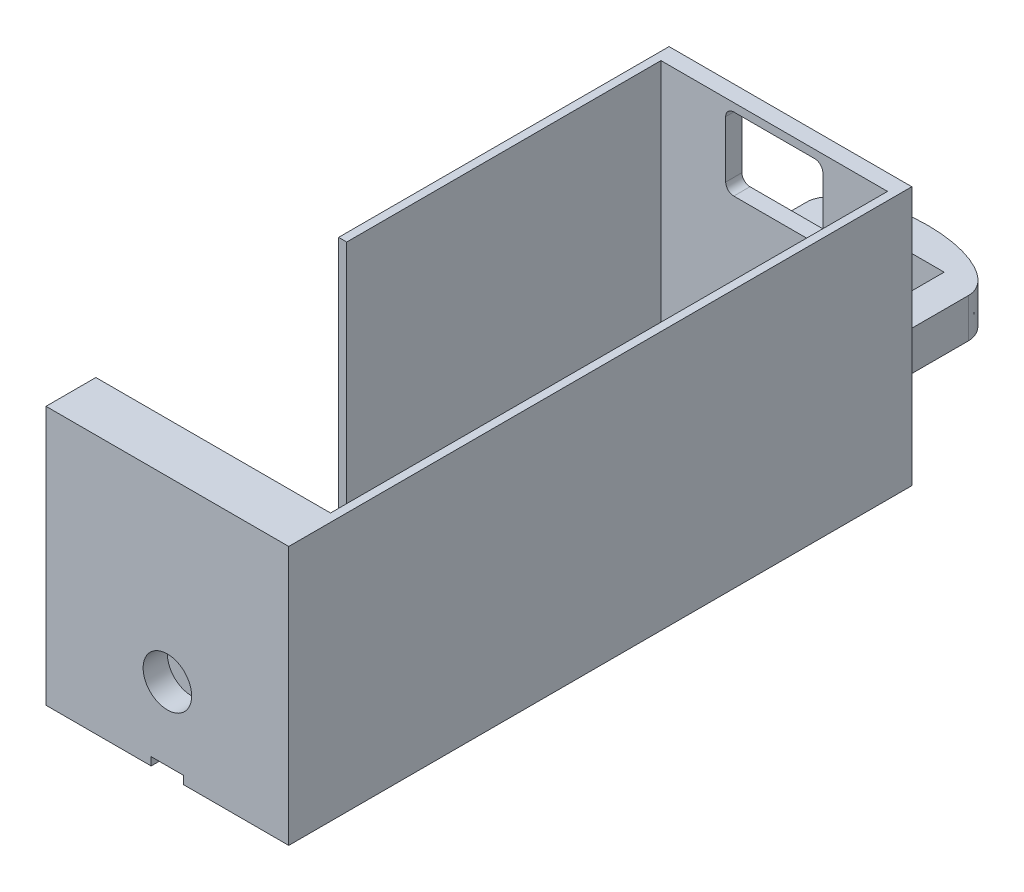
ISO-10303-21;
HEADER;
FILE_DESCRIPTION(('STEP AP214'),'2;1');
FILE_NAME('part.step','',(''),(''),'','','');
FILE_SCHEMA(('AUTOMOTIVE_DESIGN { 1 0 10303 214 1 1 1 1 }'));
ENDSEC;
DATA;
#1=APPLICATION_CONTEXT('core data for automotive mechanical design processes');
#2=APPLICATION_PROTOCOL_DEFINITION('international standard','automotive_design',2000,#1);
#3=PRODUCT_CONTEXT('',#1,'mechanical');
#4=PRODUCT('Part','Part','',(#3));
#5=PRODUCT_RELATED_PRODUCT_CATEGORY('part','',(#4));
#6=PRODUCT_DEFINITION_FORMATION('','',#4);
#7=PRODUCT_DEFINITION_CONTEXT('part definition',#1,'design');
#8=PRODUCT_DEFINITION('design','',#6,#7);
#9=PRODUCT_DEFINITION_SHAPE('','',#8);
#10=(LENGTH_UNIT() NAMED_UNIT(*) SI_UNIT(.MILLI.,.METRE.));
#11=(NAMED_UNIT(*) PLANE_ANGLE_UNIT() SI_UNIT($,.RADIAN.));
#12=(NAMED_UNIT(*) SI_UNIT($,.STERADIAN.) SOLID_ANGLE_UNIT());
#13=UNCERTAINTY_MEASURE_WITH_UNIT(LENGTH_MEASURE(1.E-05),#10,'distance_accuracy_value','');
#14=(GEOMETRIC_REPRESENTATION_CONTEXT(3) GLOBAL_UNCERTAINTY_ASSIGNED_CONTEXT((#13)) GLOBAL_UNIT_ASSIGNED_CONTEXT((#10,
#11,#12)) REPRESENTATION_CONTEXT('',''));
#15=CARTESIAN_POINT('',(0.,0.,0.));
#16=DIRECTION('',(0.,0.,1.));
#17=DIRECTION('',(1.,0.,0.));
#18=AXIS2_PLACEMENT_3D('',#15,#16,#17);
#19=CARTESIAN_POINT('',(0.,0.,0.));
#20=DIRECTION('',(0.,0.,-1.));
#21=DIRECTION('',(-1.,0.,0.));
#22=AXIS2_PLACEMENT_3D('',#19,#20,#21);
#23=PLANE('',#22);
#24=DIRECTION('',(-1.,0.,0.));
#25=VECTOR('',#24,1.);
#26=CARTESIAN_POINT('',(26.,8.,0.));
#27=LINE('',#26,#25);
#28=CARTESIAN_POINT('',(10.,8.,0.));
#29=VERTEX_POINT('',#28);
#30=CARTESIAN_POINT('',(6.,8.,0.));
#31=VERTEX_POINT('',#30);
#32=EDGE_CURVE('E325',#29,#31,#27,.T.);
#33=ORIENTED_EDGE('',*,*,#32,.F.);
#34=DIRECTION('',(0.,1.,0.));
#35=VECTOR('',#34,1.);
#36=CARTESIAN_POINT('',(10.,6.85630345535087,0.));
#37=LINE('',#36,#35);
#38=CARTESIAN_POINT('',(10.,12.8563034553508,0.));
#39=VERTEX_POINT('',#38);
#40=EDGE_CURVE('E308',#29,#39,#37,.T.);
#41=ORIENTED_EDGE('',*,*,#40,.T.);
#42=DIRECTION('',(1.,0.,0.));
#43=VECTOR('',#42,1.);
#44=CARTESIAN_POINT('',(26.,12.8563034553508,0.));
#45=LINE('',#44,#43);
#46=CARTESIAN_POINT('',(6.,12.8563034553508,0.));
#47=VERTEX_POINT('',#46);
#48=EDGE_CURVE('E333',#47,#39,#45,.T.);
#49=ORIENTED_EDGE('',*,*,#48,.F.);
#50=DIRECTION('',(0.,1.,0.));
#51=VECTOR('',#50,1.);
#52=CARTESIAN_POINT('',(6.,8.,0.));
#53=LINE('',#52,#51);
#54=EDGE_CURVE('E329',#31,#47,#53,.T.);
#55=ORIENTED_EDGE('',*,*,#54,.F.);
#56=EDGE_LOOP('',(#33,#41,#49,#55));
#57=FACE_BOUND('',#56,.T.);
#58=DIRECTION('',(0.,1.,0.));
#59=VECTOR('',#58,1.);
#60=CARTESIAN_POINT('',(22.,6.85630345535087,0.));
#61=LINE('',#60,#59);
#62=CARTESIAN_POINT('',(22.,8.,0.));
#63=VERTEX_POINT('',#62);
#64=CARTESIAN_POINT('',(22.,12.8563034553508,0.));
#65=VERTEX_POINT('',#64);
#66=EDGE_CURVE('E305',#63,#65,#61,.T.);
#67=ORIENTED_EDGE('',*,*,#66,.F.);
#68=CARTESIAN_POINT('',(26.,8.,0.));
#69=VERTEX_POINT('',#68);
#70=EDGE_CURVE('E326',#69,#63,#27,.T.);
#71=ORIENTED_EDGE('',*,*,#70,.F.);
#72=DIRECTION('',(0.,-1.,0.));
#73=VECTOR('',#72,1.);
#74=CARTESIAN_POINT('',(26.,8.,0.));
#75=LINE('',#74,#73);
#76=CARTESIAN_POINT('',(26.,12.8563034553508,0.));
#77=VERTEX_POINT('',#76);
#78=EDGE_CURVE('E322',#77,#69,#75,.T.);
#79=ORIENTED_EDGE('',*,*,#78,.F.);
#80=EDGE_CURVE('E332',#65,#77,#45,.T.);
#81=ORIENTED_EDGE('',*,*,#80,.F.);
#82=EDGE_LOOP('',(#67,#71,#79,#81));
#83=FACE_BOUND('',#82,.T.);
#84=DIRECTION('',(1.,0.,0.));
#85=VECTOR('',#84,1.);
#86=CARTESIAN_POINT('',(21.,22.,0.));
#87=LINE('',#86,#85);
#88=CARTESIAN_POINT('',(9.99999999999999,22.,0.));
#89=VERTEX_POINT('',#88);
#90=CARTESIAN_POINT('',(20.,22.,0.));
#91=VERTEX_POINT('',#90);
#92=EDGE_CURVE('E614',#89,#91,#87,.T.);
#93=ORIENTED_EDGE('',*,*,#92,.T.);
#94=CARTESIAN_POINT('',(20.,23.,0.));
#95=DIRECTION('',(0.,0.,-1.));
#96=DIRECTION('',(-1.,0.,0.));
#97=AXIS2_PLACEMENT_3D('',#94,#95,#96);
#98=CIRCLE('',#97,1.);
#99=CARTESIAN_POINT('',(21.,23.,0.));
#100=VERTEX_POINT('',#99);
#101=EDGE_CURVE('E594',#91,#100,#98,.F.);
#102=ORIENTED_EDGE('',*,*,#101,.T.);
#103=DIRECTION('',(0.,1.,0.));
#104=VECTOR('',#103,1.);
#105=CARTESIAN_POINT('',(21.,31.,0.));
#106=LINE('',#105,#104);
#107=CARTESIAN_POINT('',(21.,30.,0.));
#108=VERTEX_POINT('',#107);
#109=EDGE_CURVE('E620',#100,#108,#106,.T.);
#110=ORIENTED_EDGE('',*,*,#109,.T.);
#111=CARTESIAN_POINT('',(20.,30.,0.));
#112=DIRECTION('',(0.,0.,-1.));
#113=DIRECTION('',(-1.,0.,0.));
#114=AXIS2_PLACEMENT_3D('',#111,#112,#113);
#115=CIRCLE('',#114,1.);
#116=CARTESIAN_POINT('',(20.,31.,0.));
#117=VERTEX_POINT('',#116);
#118=EDGE_CURVE('E590',#108,#117,#115,.F.);
#119=ORIENTED_EDGE('',*,*,#118,.T.);
#120=DIRECTION('',(-1.,0.,0.));
#121=VECTOR('',#120,1.);
#122=CARTESIAN_POINT('',(21.,31.,0.));
#123=LINE('',#122,#121);
#124=CARTESIAN_POINT('',(9.99999999999999,31.,0.));
#125=VERTEX_POINT('',#124);
#126=EDGE_CURVE('E615',#117,#125,#123,.T.);
#127=ORIENTED_EDGE('',*,*,#126,.T.);
#128=CARTESIAN_POINT('',(9.99999999999999,30.,0.));
#129=DIRECTION('',(0.,0.,-1.));
#130=DIRECTION('',(-1.,0.,0.));
#131=AXIS2_PLACEMENT_3D('',#128,#129,#130);
#132=CIRCLE('',#131,1.);
#133=CARTESIAN_POINT('',(8.99999999999999,30.,0.));
#134=VERTEX_POINT('',#133);
#135=EDGE_CURVE('E12',#125,#134,#132,.F.);
#136=ORIENTED_EDGE('',*,*,#135,.T.);
#137=DIRECTION('',(0.,-1.,0.));
#138=VECTOR('',#137,1.);
#139=CARTESIAN_POINT('',(8.99999999999999,31.,0.));
#140=LINE('',#139,#138);
#141=CARTESIAN_POINT('',(8.99999999999999,23.,0.));
#142=VERTEX_POINT('',#141);
#143=EDGE_CURVE('E612',#134,#142,#140,.T.);
#144=ORIENTED_EDGE('',*,*,#143,.T.);
#145=CARTESIAN_POINT('',(9.99999999999999,23.,0.));
#146=DIRECTION('',(0.,0.,-1.));
#147=DIRECTION('',(-1.,0.,0.));
#148=AXIS2_PLACEMENT_3D('',#145,#146,#147);
#149=CIRCLE('',#148,1.);
#150=EDGE_CURVE('E598',#142,#89,#149,.F.);
#151=ORIENTED_EDGE('',*,*,#150,.T.);
#152=EDGE_LOOP('',(#93,#102,#110,#119,#127,#136,#144,#151));
#153=FACE_BOUND('',#152,.T.);
#154=DIRECTION('',(1.,0.,0.));
#155=VECTOR('',#154,1.);
#156=CARTESIAN_POINT('',(0.,0.,0.));
#157=LINE('',#156,#155);
#158=CARTESIAN_POINT('',(17.,0.,0.));
#159=VERTEX_POINT('',#158);
#160=CARTESIAN_POINT('',(30.,0.,0.));
#161=VERTEX_POINT('',#160);
#162=EDGE_CURVE('E673',#159,#161,#157,.T.);
#163=ORIENTED_EDGE('',*,*,#162,.F.);
#164=DIRECTION('',(0.,1.,0.));
#165=VECTOR('',#164,1.);
#166=CARTESIAN_POINT('',(17.,0.,0.));
#167=LINE('',#166,#165);
#168=CARTESIAN_POINT('',(17.,1.,0.));
#169=VERTEX_POINT('',#168);
#170=EDGE_CURVE('E271',#159,#169,#167,.T.);
#171=ORIENTED_EDGE('',*,*,#170,.T.);
#172=DIRECTION('',(-1.,0.,0.));
#173=VECTOR('',#172,1.);
#174=CARTESIAN_POINT('',(17.,1.,0.));
#175=LINE('',#174,#173);
#176=CARTESIAN_POINT('',(13.,1.,0.));
#177=VERTEX_POINT('',#176);
#178=EDGE_CURVE('E260',#169,#177,#175,.T.);
#179=ORIENTED_EDGE('',*,*,#178,.T.);
#180=DIRECTION('',(0.,1.,0.));
#181=VECTOR('',#180,1.);
#182=CARTESIAN_POINT('',(13.,0.,0.));
#183=LINE('',#182,#181);
#184=CARTESIAN_POINT('',(13.,0.,0.));
#185=VERTEX_POINT('',#184);
#186=EDGE_CURVE('E253',#185,#177,#183,.T.);
#187=ORIENTED_EDGE('',*,*,#186,.F.);
#188=CARTESIAN_POINT('',(0.,0.,0.));
#189=VERTEX_POINT('',#188);
#190=EDGE_CURVE('E674',#189,#185,#157,.T.);
#191=ORIENTED_EDGE('',*,*,#190,.F.);
#192=DIRECTION('',(0.,-1.,0.));
#193=VECTOR('',#192,1.);
#194=CARTESIAN_POINT('',(0.,0.,0.));
#195=LINE('',#194,#193);
#196=CARTESIAN_POINT('',(0.,32.,0.));
#197=VERTEX_POINT('',#196);
#198=EDGE_CURVE('E654',#197,#189,#195,.T.);
#199=ORIENTED_EDGE('',*,*,#198,.F.);
#200=DIRECTION('',(-1.,0.,0.));
#201=VECTOR('',#200,1.);
#202=CARTESIAN_POINT('',(0.,32.,0.));
#203=LINE('',#202,#201);
#204=CARTESIAN_POINT('',(30.,32.,0.));
#205=VERTEX_POINT('',#204);
#206=EDGE_CURVE('E663',#205,#197,#203,.T.);
#207=ORIENTED_EDGE('',*,*,#206,.F.);
#208=DIRECTION('',(0.,1.,0.));
#209=VECTOR('',#208,1.);
#210=CARTESIAN_POINT('',(30.,0.,0.));
#211=LINE('',#210,#209);
#212=EDGE_CURVE('E677',#161,#205,#211,.T.);
#213=ORIENTED_EDGE('',*,*,#212,.F.);
#214=EDGE_LOOP('',(#163,#171,#179,#187,#191,#199,#207,#213));
#215=FACE_BOUND('',#214,.T.);
#216=ADVANCED_FACE('F39',(#57,#83,#153,#215),#23,.T.);
#217=CARTESIAN_POINT('',(0.,0.,77.));
#218=DIRECTION('',(0.,1.,0.));
#219=DIRECTION('',(0.,0.,1.));
#220=AXIS2_PLACEMENT_3D('',#217,#218,#219);
#221=PLANE('',#220);
#222=DIRECTION('',(0.,0.,-1.));
#223=VECTOR('',#222,1.);
#224=CARTESIAN_POINT('',(17.,0.,77.));
#225=LINE('',#224,#223);
#226=CARTESIAN_POINT('',(17.,0.,77.));
#227=VERTEX_POINT('',#226);
#228=EDGE_CURVE('E248',#227,#159,#225,.T.);
#229=ORIENTED_EDGE('',*,*,#228,.T.);
#230=ORIENTED_EDGE('',*,*,#162,.T.);
#231=DIRECTION('',(0.,0.,-1.));
#232=VECTOR('',#231,1.);
#233=CARTESIAN_POINT('',(30.,0.,77.));
#234=LINE('',#233,#232);
#235=CARTESIAN_POINT('',(30.,0.,77.));
#236=VERTEX_POINT('',#235);
#237=EDGE_CURVE('E687',#236,#161,#234,.T.);
#238=ORIENTED_EDGE('',*,*,#237,.F.);
#239=DIRECTION('',(1.,0.,0.));
#240=VECTOR('',#239,1.);
#241=CARTESIAN_POINT('',(0.,0.,77.));
#242=LINE('',#241,#240);
#243=EDGE_CURVE('E662',#227,#236,#242,.T.);
#244=ORIENTED_EDGE('',*,*,#243,.F.);
#245=EDGE_LOOP('',(#229,#230,#238,#244));
#246=FACE_BOUND('',#245,.T.);
#247=ADVANCED_FACE('F412',(#246),#221,.F.);
#248=CARTESIAN_POINT('',(0.,0.,77.));
#249=DIRECTION('',(0.,0.,-1.));
#250=DIRECTION('',(-1.,0.,0.));
#251=AXIS2_PLACEMENT_3D('',#248,#249,#250);
#252=PLANE('',#251);
#253=CARTESIAN_POINT('',(15.,10.,77.));
#254=DIRECTION('',(0.,0.,1.));
#255=DIRECTION('',(1.,0.,0.));
#256=AXIS2_PLACEMENT_3D('',#253,#254,#255);
#257=CIRCLE('',#256,3.);
#258=CARTESIAN_POINT('',(18.,10.,77.));
#259=VERTEX_POINT('',#258);
#260=EDGE_CURVE('E1060',#259,#259,#257,.T.);
#261=ORIENTED_EDGE('',*,*,#260,.F.);
#262=EDGE_LOOP('',(#261));
#263=FACE_BOUND('',#262,.T.);
#264=DIRECTION('',(0.,1.,0.));
#265=VECTOR('',#264,1.);
#266=CARTESIAN_POINT('',(17.,0.,77.));
#267=LINE('',#266,#265);
#268=CARTESIAN_POINT('',(17.,1.,77.));
#269=VERTEX_POINT('',#268);
#270=EDGE_CURVE('E242',#227,#269,#267,.T.);
#271=ORIENTED_EDGE('',*,*,#270,.F.);
#272=ORIENTED_EDGE('',*,*,#243,.T.);
#273=DIRECTION('',(0.,1.,0.));
#274=VECTOR('',#273,1.);
#275=CARTESIAN_POINT('',(30.,0.,77.));
#276=LINE('',#275,#274);
#277=CARTESIAN_POINT('',(30.,32.,77.));
#278=VERTEX_POINT('',#277);
#279=EDGE_CURVE('E666',#236,#278,#276,.T.);
#280=ORIENTED_EDGE('',*,*,#279,.T.);
#281=DIRECTION('',(-1.,0.,0.));
#282=VECTOR('',#281,1.);
#283=CARTESIAN_POINT('',(0.,32.,77.));
#284=LINE('',#283,#282);
#285=CARTESIAN_POINT('',(0.,32.,77.));
#286=VERTEX_POINT('',#285);
#287=EDGE_CURVE('E668',#278,#286,#284,.T.);
#288=ORIENTED_EDGE('',*,*,#287,.T.);
#289=DIRECTION('',(0.,-1.,0.));
#290=VECTOR('',#289,1.);
#291=CARTESIAN_POINT('',(0.,0.,77.));
#292=LINE('',#291,#290);
#293=CARTESIAN_POINT('',(0.,0.,77.));
#294=VERTEX_POINT('',#293);
#295=EDGE_CURVE('E659',#286,#294,#292,.T.);
#296=ORIENTED_EDGE('',*,*,#295,.T.);
#297=CARTESIAN_POINT('',(13.,0.,77.));
#298=VERTEX_POINT('',#297);
#299=EDGE_CURVE('E664',#294,#298,#242,.T.);
#300=ORIENTED_EDGE('',*,*,#299,.T.);
#301=DIRECTION('',(0.,1.,0.));
#302=VECTOR('',#301,1.);
#303=CARTESIAN_POINT('',(13.,0.,77.));
#304=LINE('',#303,#302);
#305=CARTESIAN_POINT('',(13.,1.,77.));
#306=VERTEX_POINT('',#305);
#307=EDGE_CURVE('E266',#298,#306,#304,.T.);
#308=ORIENTED_EDGE('',*,*,#307,.T.);
#309=DIRECTION('',(-1.,0.,0.));
#310=VECTOR('',#309,1.);
#311=CARTESIAN_POINT('',(17.,1.,77.));
#312=LINE('',#311,#310);
#313=EDGE_CURVE('E252',#269,#306,#312,.T.);
#314=ORIENTED_EDGE('',*,*,#313,.F.);
#315=EDGE_LOOP('',(#271,#272,#280,#288,#296,#300,#308,#314));
#316=FACE_BOUND('',#315,.T.);
#317=ADVANCED_FACE('F264',(#263,#316),#252,.F.);
#318=CARTESIAN_POINT('',(16.,13.3419338008859,-16.));
#319=CARTESIAN_POINT('',(16.,11.3994124187456,-16.));
#320=CARTESIAN_POINT('',(16.,9.45689103660526,-16.));
#321=CARTESIAN_POINT('',(16.,7.51436965446492,-16.));
#322=CARTESIAN_POINT('',(26.,13.3419338008859,-16.));
#323=CARTESIAN_POINT('',(26.,11.3994124187456,-16.));
#324=CARTESIAN_POINT('',(26.,9.45689103660526,-16.));
#325=CARTESIAN_POINT('',(26.,7.51436965446492,-16.));
#326=CARTESIAN_POINT('',(26.,13.3419338008859,-11.));
#327=CARTESIAN_POINT('',(26.,11.3994124187456,-11.));
#328=CARTESIAN_POINT('',(26.,9.45689103660526,-11.));
#329=CARTESIAN_POINT('',(26.,7.51436965446492,-11.));
#330=(BOUNDED_SURFACE() B_SPLINE_SURFACE(2,3,((#318,#319,#320,#321),(#322,#323,#324,#325),(#326,
#327,#328,#329)),.UNSPECIFIED.,.F.,.F.,.F.) B_SPLINE_SURFACE_WITH_KNOTS((3,3),(4,4),(0.,1.),
(-0.0133419338008859,-0.00751436965446492),
.UNSPECIFIED.) GEOMETRIC_REPRESENTATION_ITEM() RATIONAL_B_SPLINE_SURFACE(((1.,1.,1.,1.),
(0.707106781186547,0.707106781186547,0.707106781186547,0.707106781186547),(1.,1.,1.,1.))) REPRESENTATION_ITEM('') SURFACE());
#331=CARTESIAN_POINT('',(16.,7.51436965446492,-16.));
#332=CARTESIAN_POINT('',(16.,9.45689103660526,-16.));
#333=CARTESIAN_POINT('',(16.,11.3994124187456,-16.));
#334=CARTESIAN_POINT('',(16.,13.3419338008859,-16.));
#335=(BOUNDED_CURVE() B_SPLINE_CURVE(3,(#331,#332,#333,#334),.UNSPECIFIED.,.F.,
.F.) B_SPLINE_CURVE_WITH_KNOTS((4,4),(-0.0133419338008859,-0.00751436965446492),
.UNSPECIFIED.) CURVE() GEOMETRIC_REPRESENTATION_ITEM() RATIONAL_B_SPLINE_CURVE((1.,1.,1.,1.)) REPRESENTATION_ITEM(''));
#336=CARTESIAN_POINT('',(16.,8.,-16.));
#337=VERTEX_POINT('',#336);
#338=CARTESIAN_POINT('',(16.,12.8563034553508,-16.));
#339=VERTEX_POINT('',#338);
#340=EDGE_CURVE('E516',#337,#339,#335,.T.);
#341=CARTESIAN_POINT('',(16.,12.8563034553508,-16.));
#342=CARTESIAN_POINT('',(26.,12.8563034553508,-16.));
#343=CARTESIAN_POINT('',(26.,12.8563034553508,-11.));
#344=(BOUNDED_CURVE() B_SPLINE_CURVE(2,(#341,#342,#343),.UNSPECIFIED.,.F.,
.F.) B_SPLINE_CURVE_WITH_KNOTS((3,3),(0.,1.),
.UNSPECIFIED.) CURVE() GEOMETRIC_REPRESENTATION_ITEM() RATIONAL_B_SPLINE_CURVE((1.,
0.707106781186548,1.)) REPRESENTATION_ITEM(''));
#345=CARTESIAN_POINT('',(26.,12.8563034553508,-11.));
#346=VERTEX_POINT('',#345);
#347=EDGE_CURVE('E525',#346,#339,#344,.F.);
#348=CARTESIAN_POINT('',(26.,13.3419338008859,-11.));
#349=CARTESIAN_POINT('',(26.,11.3994124187456,-11.));
#350=CARTESIAN_POINT('',(26.,9.45689103660526,-11.));
#351=CARTESIAN_POINT('',(26.,7.51436965446492,-11.));
#352=(BOUNDED_CURVE() B_SPLINE_CURVE(3,(#348,#349,#350,#351),.UNSPECIFIED.,.F.,
.F.) B_SPLINE_CURVE_WITH_KNOTS((4,4),(-0.0133419338008859,-0.00751436965446492),
.UNSPECIFIED.) CURVE() GEOMETRIC_REPRESENTATION_ITEM() RATIONAL_B_SPLINE_CURVE((1.,1.,1.,1.)) REPRESENTATION_ITEM(''));
#353=CARTESIAN_POINT('',(26.,8.,-11.));
#354=VERTEX_POINT('',#353);
#355=EDGE_CURVE('E353',#354,#346,#352,.F.);
#356=CARTESIAN_POINT('',(26.,8.,-11.));
#357=CARTESIAN_POINT('',(26.,8.,-16.));
#358=CARTESIAN_POINT('',(16.,8.,-16.));
#359=(BOUNDED_CURVE() B_SPLINE_CURVE(2,(#356,#357,#358),.UNSPECIFIED.,.F.,
.F.) B_SPLINE_CURVE_WITH_KNOTS((3,3),(0.,1.),
.UNSPECIFIED.) CURVE() GEOMETRIC_REPRESENTATION_ITEM() RATIONAL_B_SPLINE_CURVE((1.,
0.707106781186547,1.)) REPRESENTATION_ITEM(''));
#360=EDGE_CURVE('E527',#337,#354,#359,.F.);
#361=ORIENTED_EDGE('',*,*,#340,.T.);
#362=ORIENTED_EDGE('',*,*,#347,.F.);
#363=ORIENTED_EDGE('',*,*,#355,.F.);
#364=ORIENTED_EDGE('',*,*,#360,.F.);
#365=EDGE_LOOP('',(#361,#362,#363,#364));
#366=FACE_BOUND('',#365,.T.);
#367=ADVANCED_FACE('F411',(#366),#330,.T.);
#368=CARTESIAN_POINT('',(16.,7.51436965446492,-16.));
#369=CARTESIAN_POINT('',(16.,9.45689103660526,-16.));
#370=CARTESIAN_POINT('',(16.,11.3994124187456,-16.));
#371=CARTESIAN_POINT('',(16.,13.3419338008859,-16.));
#372=CARTESIAN_POINT('',(6.,7.51436965446492,-16.));
#373=CARTESIAN_POINT('',(6.,9.45689103660526,-16.));
#374=CARTESIAN_POINT('',(6.,11.3994124187456,-16.));
#375=CARTESIAN_POINT('',(6.,13.3419338008859,-16.));
#376=CARTESIAN_POINT('',(6.,7.51436965446492,-11.));
#377=CARTESIAN_POINT('',(6.,9.45689103660526,-11.));
#378=CARTESIAN_POINT('',(6.,11.3994124187456,-11.));
#379=CARTESIAN_POINT('',(6.,13.3419338008859,-11.));
#380=(BOUNDED_SURFACE() B_SPLINE_SURFACE(2,3,((#368,#369,#370,#371),(#372,#373,#374,#375),(#376,
#377,#378,#379)),.UNSPECIFIED.,.F.,.F.,.F.) B_SPLINE_SURFACE_WITH_KNOTS((3,3),(4,4),(0.,1.),
(0.00751436965446492,0.0133419338008859),
.UNSPECIFIED.) GEOMETRIC_REPRESENTATION_ITEM() RATIONAL_B_SPLINE_SURFACE(((1.,1.,1.,1.),
(0.707106781186547,0.707106781186547,0.707106781186547,0.707106781186547),(1.,1.,1.,1.))) REPRESENTATION_ITEM('') SURFACE());
#381=CARTESIAN_POINT('',(16.,8.,-16.));
#382=CARTESIAN_POINT('',(6.,8.,-16.));
#383=CARTESIAN_POINT('',(6.,8.,-11.));
#384=(BOUNDED_CURVE() B_SPLINE_CURVE(2,(#381,#382,#383),.UNSPECIFIED.,.F.,
.F.) B_SPLINE_CURVE_WITH_KNOTS((3,3),(0.,1.),
.UNSPECIFIED.) CURVE() GEOMETRIC_REPRESENTATION_ITEM() RATIONAL_B_SPLINE_CURVE((1.,
0.707106781186547,1.)) REPRESENTATION_ITEM(''));
#385=CARTESIAN_POINT('',(6.,8.,-11.));
#386=VERTEX_POINT('',#385);
#387=EDGE_CURVE('E522',#386,#337,#384,.F.);
#388=CARTESIAN_POINT('',(6.,7.51436965446492,-11.));
#389=CARTESIAN_POINT('',(6.,9.45689103660526,-11.));
#390=CARTESIAN_POINT('',(6.,11.3994124187456,-11.));
#391=CARTESIAN_POINT('',(6.,13.3419338008859,-11.));
#392=(BOUNDED_CURVE() B_SPLINE_CURVE(3,(#388,#389,#390,#391),.UNSPECIFIED.,.F.,
.F.) B_SPLINE_CURVE_WITH_KNOTS((4,4),(0.00751436965446492,0.0133419338008859),
.UNSPECIFIED.) CURVE() GEOMETRIC_REPRESENTATION_ITEM() RATIONAL_B_SPLINE_CURVE((1.,1.,1.,1.)) REPRESENTATION_ITEM(''));
#393=CARTESIAN_POINT('',(6.,12.8563034553508,-11.));
#394=VERTEX_POINT('',#393);
#395=EDGE_CURVE('E518',#394,#386,#392,.F.);
#396=CARTESIAN_POINT('',(6.,12.8563034553508,-11.));
#397=CARTESIAN_POINT('',(6.,12.8563034553508,-16.));
#398=CARTESIAN_POINT('',(16.,12.8563034553508,-16.));
#399=(BOUNDED_CURVE() B_SPLINE_CURVE(2,(#396,#397,#398),.UNSPECIFIED.,.F.,
.F.) B_SPLINE_CURVE_WITH_KNOTS((3,3),(0.,1.),
.UNSPECIFIED.) CURVE() GEOMETRIC_REPRESENTATION_ITEM() RATIONAL_B_SPLINE_CURVE((1.,
0.707106781186547,1.)) REPRESENTATION_ITEM(''));
#400=EDGE_CURVE('E514',#339,#394,#399,.F.);
#401=ORIENTED_EDGE('',*,*,#340,.F.);
#402=ORIENTED_EDGE('',*,*,#387,.F.);
#403=ORIENTED_EDGE('',*,*,#395,.F.);
#404=ORIENTED_EDGE('',*,*,#400,.F.);
#405=EDGE_LOOP('',(#401,#402,#403,#404));
#406=FACE_BOUND('',#405,.T.);
#407=ADVANCED_FACE('F431',(#406),#380,.T.);
#408=CARTESIAN_POINT('',(0.,0.,77.));
#409=DIRECTION('',(1.,0.,0.));
#410=DIRECTION('',(0.,1.,0.));
#411=AXIS2_PLACEMENT_3D('',#408,#409,#410);
#412=PLANE('',#411);
#413=DIRECTION('',(0.,0.,-1.));
#414=VECTOR('',#413,1.);
#415=CARTESIAN_POINT('',(0.,32.,77.));
#416=LINE('',#415,#414);
#417=CARTESIAN_POINT('',(0.,32.,70.83700160045));
#418=VERTEX_POINT('',#417);
#419=EDGE_CURVE('E681',#286,#418,#416,.T.);
#420=ORIENTED_EDGE('',*,*,#419,.T.);
#421=DIRECTION('',(0.,1.,0.));
#422=VECTOR('',#421,1.);
#423=CARTESIAN_POINT('',(0.,32.,70.83700160045));
#424=LINE('',#423,#422);
#425=CARTESIAN_POINT('',(0.,2.,70.83700160045));
#426=VERTEX_POINT('',#425);
#427=EDGE_CURVE('E261',#426,#418,#424,.T.);
#428=ORIENTED_EDGE('',*,*,#427,.F.);
#429=DIRECTION('',(0.,0.,1.));
#430=VECTOR('',#429,1.);
#431=CARTESIAN_POINT('',(0.,2.,70.83700160045));
#432=LINE('',#431,#430);
#433=CARTESIAN_POINT('',(0.,2.,40.83700160045));
#434=VERTEX_POINT('',#433);
#435=EDGE_CURVE('E286',#434,#426,#432,.T.);
#436=ORIENTED_EDGE('',*,*,#435,.F.);
#437=DIRECTION('',(0.,-1.,0.));
#438=VECTOR('',#437,1.);
#439=CARTESIAN_POINT('',(0.,32.,40.83700160045));
#440=LINE('',#439,#438);
#441=CARTESIAN_POINT('',(0.,32.,40.83700160045));
#442=VERTEX_POINT('',#441);
#443=EDGE_CURVE('E283',#442,#434,#440,.T.);
#444=ORIENTED_EDGE('',*,*,#443,.F.);
#445=EDGE_CURVE('E670',#442,#197,#416,.T.);
#446=ORIENTED_EDGE('',*,*,#445,.T.);
#447=ORIENTED_EDGE('',*,*,#198,.T.);
#448=DIRECTION('',(0.,0.,-1.));
#449=VECTOR('',#448,1.);
#450=CARTESIAN_POINT('',(0.,0.,77.));
#451=LINE('',#450,#449);
#452=EDGE_CURVE('E530',#294,#189,#451,.T.);
#453=ORIENTED_EDGE('',*,*,#452,.F.);
#454=ORIENTED_EDGE('',*,*,#295,.F.);
#455=EDGE_LOOP('',(#420,#428,#436,#444,#446,#447,#453,#454));
#456=FACE_BOUND('',#455,.T.);
#457=ADVANCED_FACE('F427',(#456),#412,.F.);
#458=ORIENTED_EDGE('',*,*,#190,.T.);
#459=DIRECTION('',(0.,0.,-1.));
#460=VECTOR('',#459,1.);
#461=CARTESIAN_POINT('',(13.,0.,77.));
#462=LINE('',#461,#460);
#463=EDGE_CURVE('E278',#298,#185,#462,.T.);
#464=ORIENTED_EDGE('',*,*,#463,.F.);
#465=ORIENTED_EDGE('',*,*,#299,.F.);
#466=ORIENTED_EDGE('',*,*,#452,.T.);
#467=EDGE_LOOP('',(#458,#464,#465,#466));
#468=FACE_BOUND('',#467,.T.);
#469=ADVANCED_FACE('F423',(#468),#221,.F.);
#470=CARTESIAN_POINT('',(30.,0.,77.));
#471=DIRECTION('',(-1.,0.,0.));
#472=DIRECTION('',(0.,-1.,0.));
#473=AXIS2_PLACEMENT_3D('',#470,#471,#472);
#474=PLANE('',#473);
#475=ORIENTED_EDGE('',*,*,#212,.T.);
#476=DIRECTION('',(0.,0.,-1.));
#477=VECTOR('',#476,1.);
#478=CARTESIAN_POINT('',(30.,32.,77.));
#479=LINE('',#478,#477);
#480=EDGE_CURVE('E684',#278,#205,#479,.T.);
#481=ORIENTED_EDGE('',*,*,#480,.F.);
#482=ORIENTED_EDGE('',*,*,#279,.F.);
#483=ORIENTED_EDGE('',*,*,#237,.T.);
#484=EDGE_LOOP('',(#475,#481,#482,#483));
#485=FACE_BOUND('',#484,.T.);
#486=ADVANCED_FACE('F419',(#485),#474,.F.);
#487=CARTESIAN_POINT('',(0.,32.,77.));
#488=DIRECTION('',(0.,-1.,0.));
#489=DIRECTION('',(0.,0.,-1.));
#490=AXIS2_PLACEMENT_3D('',#487,#488,#489);
#491=PLANE('',#490);
#492=DIRECTION('',(1.,0.,0.));
#493=VECTOR('',#492,1.);
#494=CARTESIAN_POINT('',(0.999999999999999,32.,70.83700160045));
#495=LINE('',#494,#493);
#496=CARTESIAN_POINT('',(29.,32.,70.83700160045));
#497=VERTEX_POINT('',#496);
#498=EDGE_CURVE('E645',#418,#497,#495,.T.);
#499=ORIENTED_EDGE('',*,*,#498,.F.);
#500=ORIENTED_EDGE('',*,*,#419,.F.);
#501=ORIENTED_EDGE('',*,*,#287,.F.);
#502=ORIENTED_EDGE('',*,*,#480,.T.);
#503=ORIENTED_EDGE('',*,*,#206,.T.);
#504=ORIENTED_EDGE('',*,*,#445,.F.);
#505=DIRECTION('',(-1.,0.,0.));
#506=VECTOR('',#505,1.);
#507=CARTESIAN_POINT('',(5.99999999999994,32.,40.83700160045));
#508=LINE('',#507,#506);
#509=CARTESIAN_POINT('',(0.999999999999997,32.,40.83700160045));
#510=VERTEX_POINT('',#509);
#511=EDGE_CURVE('E289',#510,#442,#508,.T.);
#512=ORIENTED_EDGE('',*,*,#511,.F.);
#513=DIRECTION('',(0.,0.,1.));
#514=VECTOR('',#513,1.);
#515=CARTESIAN_POINT('',(0.99999999999999,32.,2.));
#516=LINE('',#515,#514);
#517=CARTESIAN_POINT('',(0.99999999999999,32.,2.));
#518=VERTEX_POINT('',#517);
#519=EDGE_CURVE('E618',#518,#510,#516,.T.);
#520=ORIENTED_EDGE('',*,*,#519,.F.);
#521=DIRECTION('',(-1.,0.,0.));
#522=VECTOR('',#521,1.);
#523=CARTESIAN_POINT('',(0.99999999999999,32.,2.));
#524=LINE('',#523,#522);
#525=CARTESIAN_POINT('',(29.,32.,2.));
#526=VERTEX_POINT('',#525);
#527=EDGE_CURVE('E634',#526,#518,#524,.T.);
#528=ORIENTED_EDGE('',*,*,#527,.F.);
#529=DIRECTION('',(0.,0.,-1.));
#530=VECTOR('',#529,1.);
#531=CARTESIAN_POINT('',(29.,32.,2.));
#532=LINE('',#531,#530);
#533=EDGE_CURVE('E647',#497,#526,#532,.T.);
#534=ORIENTED_EDGE('',*,*,#533,.F.);
#535=EDGE_LOOP('',(#499,#500,#501,#502,#503,#504,#512,#520,#528,#534));
#536=FACE_BOUND('',#535,.T.);
#537=ADVANCED_FACE('F407',(#536),#491,.F.);
#538=CARTESIAN_POINT('',(0.99999999999999,2.00000000000002,2.));
#539=DIRECTION('',(-1.,0.,0.));
#540=DIRECTION('',(0.,0.,1.));
#541=AXIS2_PLACEMENT_3D('',#538,#539,#540);
#542=PLANE('',#541);
#543=ORIENTED_EDGE('',*,*,#519,.T.);
#544=DIRECTION('',(0.,-1.,0.));
#545=VECTOR('',#544,1.);
#546=CARTESIAN_POINT('',(0.999999999999995,2.00000000000002,40.83700160045));
#547=LINE('',#546,#545);
#548=CARTESIAN_POINT('',(0.999999999999995,2.00000000000002,40.83700160045));
#549=VERTEX_POINT('',#548);
#550=EDGE_CURVE('E292',#510,#549,#547,.T.);
#551=ORIENTED_EDGE('',*,*,#550,.T.);
#552=DIRECTION('',(0.,0.,1.));
#553=VECTOR('',#552,1.);
#554=CARTESIAN_POINT('',(0.99999999999999,2.00000000000002,2.));
#555=LINE('',#554,#553);
#556=CARTESIAN_POINT('',(0.99999999999999,2.00000000000002,2.));
#557=VERTEX_POINT('',#556);
#558=EDGE_CURVE('E630',#557,#549,#555,.T.);
#559=ORIENTED_EDGE('',*,*,#558,.F.);
#560=DIRECTION('',(0.,1.,0.));
#561=VECTOR('',#560,1.);
#562=CARTESIAN_POINT('',(0.99999999999999,2.00000000000002,2.));
#563=LINE('',#562,#561);
#564=EDGE_CURVE('E652',#557,#518,#563,.T.);
#565=ORIENTED_EDGE('',*,*,#564,.T.);
#566=EDGE_LOOP('',(#543,#551,#559,#565));
#567=FACE_BOUND('',#566,.T.);
#568=ADVANCED_FACE('F397',(#567),#542,.F.);
#569=CARTESIAN_POINT('',(0.99999999999999,2.00000000000002,2.));
#570=DIRECTION('',(0.,0.,-1.));
#571=DIRECTION('',(-1.,0.,0.));
#572=AXIS2_PLACEMENT_3D('',#569,#570,#571);
#573=PLANE('',#572);
#574=DIRECTION('',(-1.,0.,0.));
#575=VECTOR('',#574,1.);
#576=CARTESIAN_POINT('',(21.,31.,2.));
#577=LINE('',#576,#575);
#578=CARTESIAN_POINT('',(20.,31.,2.));
#579=VERTEX_POINT('',#578);
#580=CARTESIAN_POINT('',(9.99999999999999,31.,2.));
#581=VERTEX_POINT('',#580);
#582=EDGE_CURVE('E603',#579,#581,#577,.T.);
#583=ORIENTED_EDGE('',*,*,#582,.F.);
#584=CARTESIAN_POINT('',(20.,30.,2.));
#585=DIRECTION('',(0.,0.,-1.));
#586=DIRECTION('',(-1.,0.,0.));
#587=AXIS2_PLACEMENT_3D('',#584,#585,#586);
#588=CIRCLE('',#587,1.);
#589=CARTESIAN_POINT('',(21.,30.,2.));
#590=VERTEX_POINT('',#589);
#591=EDGE_CURVE('E588',#579,#590,#588,.T.);
#592=ORIENTED_EDGE('',*,*,#591,.T.);
#593=DIRECTION('',(0.,1.,0.));
#594=VECTOR('',#593,1.);
#595=CARTESIAN_POINT('',(21.,31.,2.));
#596=LINE('',#595,#594);
#597=CARTESIAN_POINT('',(21.,23.,2.));
#598=VERTEX_POINT('',#597);
#599=EDGE_CURVE('E610',#598,#590,#596,.T.);
#600=ORIENTED_EDGE('',*,*,#599,.F.);
#601=CARTESIAN_POINT('',(20.,23.,2.));
#602=DIRECTION('',(0.,0.,-1.));
#603=DIRECTION('',(-1.,0.,0.));
#604=AXIS2_PLACEMENT_3D('',#601,#602,#603);
#605=CIRCLE('',#604,1.);
#606=CARTESIAN_POINT('',(20.,22.,2.));
#607=VERTEX_POINT('',#606);
#608=EDGE_CURVE('E592',#598,#607,#605,.T.);
#609=ORIENTED_EDGE('',*,*,#608,.T.);
#610=DIRECTION('',(1.,0.,0.));
#611=VECTOR('',#610,1.);
#612=CARTESIAN_POINT('',(21.,22.,2.));
#613=LINE('',#612,#611);
#614=CARTESIAN_POINT('',(9.99999999999999,22.,2.));
#615=VERTEX_POINT('',#614);
#616=EDGE_CURVE('E627',#615,#607,#613,.T.);
#617=ORIENTED_EDGE('',*,*,#616,.F.);
#618=CARTESIAN_POINT('',(9.99999999999999,23.,2.));
#619=DIRECTION('',(0.,0.,-1.));
#620=DIRECTION('',(-1.,0.,0.));
#621=AXIS2_PLACEMENT_3D('',#618,#619,#620);
#622=CIRCLE('',#621,1.);
#623=CARTESIAN_POINT('',(8.99999999999999,23.,2.));
#624=VERTEX_POINT('',#623);
#625=EDGE_CURVE('E596',#615,#624,#622,.T.);
#626=ORIENTED_EDGE('',*,*,#625,.T.);
#627=DIRECTION('',(0.,-1.,0.));
#628=VECTOR('',#627,1.);
#629=CARTESIAN_POINT('',(8.99999999999999,31.,2.));
#630=LINE('',#629,#628);
#631=CARTESIAN_POINT('',(8.99999999999999,30.,2.));
#632=VERTEX_POINT('',#631);
#633=EDGE_CURVE('E604',#632,#624,#630,.T.);
#634=ORIENTED_EDGE('',*,*,#633,.F.);
#635=CARTESIAN_POINT('',(9.99999999999999,30.,2.));
#636=DIRECTION('',(0.,0.,-1.));
#637=DIRECTION('',(-1.,0.,0.));
#638=AXIS2_PLACEMENT_3D('',#635,#636,#637);
#639=CIRCLE('',#638,1.);
#640=EDGE_CURVE('E47',#632,#581,#639,.T.);
#641=ORIENTED_EDGE('',*,*,#640,.T.);
#642=EDGE_LOOP('',(#583,#592,#600,#609,#617,#626,#634,#641));
#643=FACE_BOUND('',#642,.T.);
#644=ORIENTED_EDGE('',*,*,#527,.T.);
#645=ORIENTED_EDGE('',*,*,#564,.F.);
#646=DIRECTION('',(-1.,0.,0.));
#647=VECTOR('',#646,1.);
#648=CARTESIAN_POINT('',(0.99999999999999,2.00000000000002,2.));
#649=LINE('',#648,#647);
#650=CARTESIAN_POINT('',(29.,2.00000000000002,2.));
#651=VERTEX_POINT('',#650);
#652=EDGE_CURVE('E639',#651,#557,#649,.T.);
#653=ORIENTED_EDGE('',*,*,#652,.F.);
#654=DIRECTION('',(0.,1.,0.));
#655=VECTOR('',#654,1.);
#656=CARTESIAN_POINT('',(29.,2.00000000000002,2.));
#657=LINE('',#656,#655);
#658=EDGE_CURVE('E655',#651,#526,#657,.T.);
#659=ORIENTED_EDGE('',*,*,#658,.T.);
#660=EDGE_LOOP('',(#644,#645,#653,#659));
#661=FACE_BOUND('',#660,.T.);
#662=ADVANCED_FACE('F393',(#643,#661),#573,.F.);
#663=CARTESIAN_POINT('',(29.,2.00000000000002,2.));
#664=DIRECTION('',(1.,0.,0.));
#665=DIRECTION('',(0.,0.,-1.));
#666=AXIS2_PLACEMENT_3D('',#663,#664,#665);
#667=PLANE('',#666);
#668=ORIENTED_EDGE('',*,*,#533,.T.);
#669=ORIENTED_EDGE('',*,*,#658,.F.);
#670=DIRECTION('',(0.,0.,-1.));
#671=VECTOR('',#670,1.);
#672=CARTESIAN_POINT('',(29.,2.00000000000002,2.));
#673=LINE('',#672,#671);
#674=CARTESIAN_POINT('',(29.,2.00000000000002,70.83700160045));
#675=VERTEX_POINT('',#674);
#676=EDGE_CURVE('E636',#675,#651,#673,.T.);
#677=ORIENTED_EDGE('',*,*,#676,.F.);
#678=DIRECTION('',(0.,1.,0.));
#679=VECTOR('',#678,1.);
#680=CARTESIAN_POINT('',(29.,2.00000000000002,70.83700160045));
#681=LINE('',#680,#679);
#682=EDGE_CURVE('E642',#675,#497,#681,.T.);
#683=ORIENTED_EDGE('',*,*,#682,.T.);
#684=EDGE_LOOP('',(#668,#669,#677,#683));
#685=FACE_BOUND('',#684,.T.);
#686=ADVANCED_FACE('F396',(#685),#667,.F.);
#687=CARTESIAN_POINT('',(0.999999999999999,2.00000000000002,70.83700160045));
#688=DIRECTION('',(0.,0.,1.));
#689=DIRECTION('',(1.,0.,0.));
#690=AXIS2_PLACEMENT_3D('',#687,#688,#689);
#691=PLANE('',#690);
#692=ORIENTED_EDGE('',*,*,#682,.F.);
#693=DIRECTION('',(1.,0.,0.));
#694=VECTOR('',#693,1.);
#695=CARTESIAN_POINT('',(0.999999999999999,2.00000000000002,70.83700160045));
#696=LINE('',#695,#694);
#697=EDGE_CURVE('E633',#426,#675,#696,.T.);
#698=ORIENTED_EDGE('',*,*,#697,.F.);
#699=ORIENTED_EDGE('',*,*,#427,.T.);
#700=ORIENTED_EDGE('',*,*,#498,.T.);
#701=EDGE_LOOP('',(#692,#698,#699,#700));
#702=FACE_BOUND('',#701,.T.);
#703=ADVANCED_FACE('F391',(#702),#691,.F.);
#704=CARTESIAN_POINT('',(0.,2.00000000000002,0.));
#705=DIRECTION('',(0.,1.,0.));
#706=DIRECTION('',(0.,0.,1.));
#707=AXIS2_PLACEMENT_3D('',#704,#705,#706);
#708=PLANE('',#707);
#709=ORIENTED_EDGE('',*,*,#558,.T.);
#710=DIRECTION('',(-1.,0.,0.));
#711=VECTOR('',#710,1.);
#712=CARTESIAN_POINT('',(5.99999999999995,2.,40.83700160045));
#713=LINE('',#712,#711);
#714=EDGE_CURVE('E290',#549,#434,#713,.T.);
#715=ORIENTED_EDGE('',*,*,#714,.T.);
#716=ORIENTED_EDGE('',*,*,#435,.T.);
#717=ORIENTED_EDGE('',*,*,#697,.T.);
#718=ORIENTED_EDGE('',*,*,#676,.T.);
#719=ORIENTED_EDGE('',*,*,#652,.T.);
#720=EDGE_LOOP('',(#709,#715,#716,#717,#718,#719));
#721=FACE_BOUND('',#720,.T.);
#722=ADVANCED_FACE('F387',(#721),#708,.T.);
#723=CARTESIAN_POINT('',(21.,31.,0.));
#724=DIRECTION('',(1.,0.,0.));
#725=DIRECTION('',(0.,0.,-1.));
#726=AXIS2_PLACEMENT_3D('',#723,#724,#725);
#727=PLANE('',#726);
#728=ORIENTED_EDGE('',*,*,#599,.T.);
#729=DIRECTION('',(0.,0.,1.));
#730=VECTOR('',#729,1.);
#731=CARTESIAN_POINT('',(21.,30.,0.));
#732=LINE('',#731,#730);
#733=EDGE_CURVE('E577',#590,#108,#732,.F.);
#734=ORIENTED_EDGE('',*,*,#733,.T.);
#735=ORIENTED_EDGE('',*,*,#109,.F.);
#736=DIRECTION('',(0.,0.,1.));
#737=VECTOR('',#736,1.);
#738=CARTESIAN_POINT('',(21.,23.,2.));
#739=LINE('',#738,#737);
#740=EDGE_CURVE('E574',#100,#598,#739,.T.);
#741=ORIENTED_EDGE('',*,*,#740,.T.);
#742=EDGE_LOOP('',(#728,#734,#735,#741));
#743=FACE_BOUND('',#742,.T.);
#744=ADVANCED_FACE('F378',(#743),#727,.F.);
#745=CARTESIAN_POINT('',(21.,22.,0.));
#746=DIRECTION('',(0.,-1.,0.));
#747=DIRECTION('',(1.,0.,0.));
#748=AXIS2_PLACEMENT_3D('',#745,#746,#747);
#749=PLANE('',#748);
#750=ORIENTED_EDGE('',*,*,#616,.T.);
#751=DIRECTION('',(0.,0.,1.));
#752=VECTOR('',#751,1.);
#753=CARTESIAN_POINT('',(20.,22.,0.));
#754=LINE('',#753,#752);
#755=EDGE_CURVE('E582',#607,#91,#754,.F.);
#756=ORIENTED_EDGE('',*,*,#755,.T.);
#757=ORIENTED_EDGE('',*,*,#92,.F.);
#758=DIRECTION('',(0.,0.,1.));
#759=VECTOR('',#758,1.);
#760=CARTESIAN_POINT('',(9.99999999999999,22.,2.));
#761=LINE('',#760,#759);
#762=EDGE_CURVE('E579',#89,#615,#761,.T.);
#763=ORIENTED_EDGE('',*,*,#762,.T.);
#764=EDGE_LOOP('',(#750,#756,#757,#763));
#765=FACE_BOUND('',#764,.T.);
#766=ADVANCED_FACE('F374',(#765),#749,.F.);
#767=CARTESIAN_POINT('',(8.99999999999999,31.,0.));
#768=DIRECTION('',(-1.,0.,0.));
#769=DIRECTION('',(0.,0.,1.));
#770=AXIS2_PLACEMENT_3D('',#767,#768,#769);
#771=PLANE('',#770);
#772=ORIENTED_EDGE('',*,*,#633,.T.);
#773=DIRECTION('',(0.,0.,1.));
#774=VECTOR('',#773,1.);
#775=CARTESIAN_POINT('',(8.99999999999999,23.,0.));
#776=LINE('',#775,#774);
#777=EDGE_CURVE('E54',#624,#142,#776,.F.);
#778=ORIENTED_EDGE('',*,*,#777,.T.);
#779=ORIENTED_EDGE('',*,*,#143,.F.);
#780=DIRECTION('',(0.,0.,1.));
#781=VECTOR('',#780,1.);
#782=CARTESIAN_POINT('',(8.99999999999999,30.,2.));
#783=LINE('',#782,#781);
#784=EDGE_CURVE('E584',#134,#632,#783,.T.);
#785=ORIENTED_EDGE('',*,*,#784,.T.);
#786=EDGE_LOOP('',(#772,#778,#779,#785));
#787=FACE_BOUND('',#786,.T.);
#788=ADVANCED_FACE('F377',(#787),#771,.F.);
#789=CARTESIAN_POINT('',(21.,31.,0.));
#790=DIRECTION('',(0.,1.,0.));
#791=DIRECTION('',(-1.,0.,0.));
#792=AXIS2_PLACEMENT_3D('',#789,#790,#791);
#793=PLANE('',#792);
#794=ORIENTED_EDGE('',*,*,#126,.F.);
#795=DIRECTION('',(0.,0.,1.));
#796=VECTOR('',#795,1.);
#797=CARTESIAN_POINT('',(20.,31.,2.));
#798=LINE('',#797,#796);
#799=EDGE_CURVE('E571',#117,#579,#798,.T.);
#800=ORIENTED_EDGE('',*,*,#799,.T.);
#801=ORIENTED_EDGE('',*,*,#582,.T.);
#802=DIRECTION('',(0.,0.,1.));
#803=VECTOR('',#802,1.);
#804=CARTESIAN_POINT('',(9.99999999999999,31.,0.));
#805=LINE('',#804,#803);
#806=EDGE_CURVE('E564',#581,#125,#805,.F.);
#807=ORIENTED_EDGE('',*,*,#806,.T.);
#808=EDGE_LOOP('',(#794,#800,#801,#807));
#809=FACE_BOUND('',#808,.T.);
#810=ADVANCED_FACE('F371',(#809),#793,.F.);
#811=CARTESIAN_POINT('',(26.,8.,-16.));
#812=DIRECTION('',(-1.,0.,0.));
#813=DIRECTION('',(0.,0.,1.));
#814=AXIS2_PLACEMENT_3D('',#811,#812,#813);
#815=PLANE('',#814);
#816=DIRECTION('',(0.,0.,1.));
#817=VECTOR('',#816,1.);
#818=CARTESIAN_POINT('',(26.,8.,-16.));
#819=LINE('',#818,#817);
#820=EDGE_CURVE('E345',#354,#69,#819,.T.);
#821=ORIENTED_EDGE('',*,*,#820,.F.);
#822=ORIENTED_EDGE('',*,*,#355,.T.);
#823=DIRECTION('',(0.,0.,1.));
#824=VECTOR('',#823,1.);
#825=CARTESIAN_POINT('',(26.,12.8563034553508,-16.));
#826=LINE('',#825,#824);
#827=EDGE_CURVE('E336',#346,#77,#826,.T.);
#828=ORIENTED_EDGE('',*,*,#827,.T.);
#829=ORIENTED_EDGE('',*,*,#78,.T.);
#830=EDGE_LOOP('',(#821,#822,#828,#829));
#831=FACE_BOUND('',#830,.T.);
#832=ADVANCED_FACE('F360',(#831),#815,.F.);
#833=CARTESIAN_POINT('',(26.,8.,-16.));
#834=DIRECTION('',(0.,1.,0.));
#835=DIRECTION('',(0.,0.,1.));
#836=AXIS2_PLACEMENT_3D('',#833,#834,#835);
#837=PLANE('',#836);
#838=ORIENTED_EDGE('',*,*,#387,.T.);
#839=ORIENTED_EDGE('',*,*,#360,.T.);
#840=ORIENTED_EDGE('',*,*,#820,.T.);
#841=ORIENTED_EDGE('',*,*,#70,.T.);
#842=DIRECTION('',(0.,0.,-1.));
#843=VECTOR('',#842,1.);
#844=CARTESIAN_POINT('',(22.,8.,-16.));
#845=LINE('',#844,#843);
#846=CARTESIAN_POINT('',(22.,8.,-12.));
#847=VERTEX_POINT('',#846);
#848=EDGE_CURVE('E319',#63,#847,#845,.T.);
#849=ORIENTED_EDGE('',*,*,#848,.T.);
#850=DIRECTION('',(-1.,0.,0.));
#851=VECTOR('',#850,1.);
#852=CARTESIAN_POINT('',(26.,8.,-12.));
#853=LINE('',#852,#851);
#854=CARTESIAN_POINT('',(10.,8.,-12.));
#855=VERTEX_POINT('',#854);
#856=EDGE_CURVE('E307',#847,#855,#853,.T.);
#857=ORIENTED_EDGE('',*,*,#856,.T.);
#858=DIRECTION('',(0.,0.,1.));
#859=VECTOR('',#858,1.);
#860=CARTESIAN_POINT('',(10.,8.,-16.));
#861=LINE('',#860,#859);
#862=EDGE_CURVE('E316',#855,#29,#861,.T.);
#863=ORIENTED_EDGE('',*,*,#862,.T.);
#864=ORIENTED_EDGE('',*,*,#32,.T.);
#865=DIRECTION('',(0.,0.,1.));
#866=VECTOR('',#865,1.);
#867=CARTESIAN_POINT('',(6.,8.,-16.));
#868=LINE('',#867,#866);
#869=EDGE_CURVE('E693',#386,#31,#868,.T.);
#870=ORIENTED_EDGE('',*,*,#869,.F.);
#871=EDGE_LOOP('',(#838,#839,#840,#841,#849,#857,#863,#864,#870));
#872=FACE_BOUND('',#871,.T.);
#873=ADVANCED_FACE('F370',(#872),#837,.F.);
#874=CARTESIAN_POINT('',(6.,8.,-16.));
#875=DIRECTION('',(1.,0.,0.));
#876=DIRECTION('',(0.,0.,-1.));
#877=AXIS2_PLACEMENT_3D('',#874,#875,#876);
#878=PLANE('',#877);
#879=DIRECTION('',(0.,0.,1.));
#880=VECTOR('',#879,1.);
#881=CARTESIAN_POINT('',(6.,12.8563034553508,-16.));
#882=LINE('',#881,#880);
#883=EDGE_CURVE('E344',#394,#47,#882,.T.);
#884=ORIENTED_EDGE('',*,*,#883,.F.);
#885=ORIENTED_EDGE('',*,*,#395,.T.);
#886=ORIENTED_EDGE('',*,*,#869,.T.);
#887=ORIENTED_EDGE('',*,*,#54,.T.);
#888=EDGE_LOOP('',(#884,#885,#886,#887));
#889=FACE_BOUND('',#888,.T.);
#890=ADVANCED_FACE('F764',(#889),#878,.F.);
#891=CARTESIAN_POINT('',(26.,12.8563034553508,-16.));
#892=DIRECTION('',(0.,-1.,0.));
#893=DIRECTION('',(0.,0.,-1.));
#894=AXIS2_PLACEMENT_3D('',#891,#892,#893);
#895=PLANE('',#894);
#896=ORIENTED_EDGE('',*,*,#827,.F.);
#897=ORIENTED_EDGE('',*,*,#347,.T.);
#898=ORIENTED_EDGE('',*,*,#400,.T.);
#899=ORIENTED_EDGE('',*,*,#883,.T.);
#900=ORIENTED_EDGE('',*,*,#48,.T.);
#901=DIRECTION('',(0.,0.,1.));
#902=VECTOR('',#901,1.);
#903=CARTESIAN_POINT('',(10.,12.8563034553508,-12.));
#904=LINE('',#903,#902);
#905=CARTESIAN_POINT('',(10.,12.8563034553508,-12.));
#906=VERTEX_POINT('',#905);
#907=EDGE_CURVE('E301',#906,#39,#904,.T.);
#908=ORIENTED_EDGE('',*,*,#907,.F.);
#909=DIRECTION('',(-1.,0.,0.));
#910=VECTOR('',#909,1.);
#911=CARTESIAN_POINT('',(22.,12.8563034553508,-12.));
#912=LINE('',#911,#910);
#913=CARTESIAN_POINT('',(22.,12.8563034553508,-12.));
#914=VERTEX_POINT('',#913);
#915=EDGE_CURVE('E298',#914,#906,#912,.T.);
#916=ORIENTED_EDGE('',*,*,#915,.F.);
#917=DIRECTION('',(0.,0.,-1.));
#918=VECTOR('',#917,1.);
#919=CARTESIAN_POINT('',(22.,12.8563034553508,-12.));
#920=LINE('',#919,#918);
#921=EDGE_CURVE('E296',#65,#914,#920,.T.);
#922=ORIENTED_EDGE('',*,*,#921,.F.);
#923=ORIENTED_EDGE('',*,*,#80,.T.);
#924=EDGE_LOOP('',(#896,#897,#898,#899,#900,#908,#916,#922,#923));
#925=FACE_BOUND('',#924,.T.);
#926=ADVANCED_FACE('F760',(#925),#895,.F.);
#927=CARTESIAN_POINT('',(22.,6.85630345535087,-12.));
#928=DIRECTION('',(1.,0.,0.));
#929=DIRECTION('',(0.,0.,-1.));
#930=AXIS2_PLACEMENT_3D('',#927,#928,#929);
#931=PLANE('',#930);
#932=ORIENTED_EDGE('',*,*,#66,.T.);
#933=ORIENTED_EDGE('',*,*,#921,.T.);
#934=DIRECTION('',(0.,1.,0.));
#935=VECTOR('',#934,1.);
#936=CARTESIAN_POINT('',(22.,6.85630345535087,-12.));
#937=LINE('',#936,#935);
#938=EDGE_CURVE('E304',#847,#914,#937,.T.);
#939=ORIENTED_EDGE('',*,*,#938,.F.);
#940=ORIENTED_EDGE('',*,*,#848,.F.);
#941=EDGE_LOOP('',(#932,#933,#939,#940));
#942=FACE_BOUND('',#941,.T.);
#943=ADVANCED_FACE('F753',(#942),#931,.F.);
#944=CARTESIAN_POINT('',(10.,6.85630345535087,-12.));
#945=DIRECTION('',(-1.,0.,0.));
#946=DIRECTION('',(0.,0.,1.));
#947=AXIS2_PLACEMENT_3D('',#944,#945,#946);
#948=PLANE('',#947);
#949=DIRECTION('',(0.,1.,0.));
#950=VECTOR('',#949,1.);
#951=CARTESIAN_POINT('',(10.,6.85630345535087,-12.));
#952=LINE('',#951,#950);
#953=EDGE_CURVE('E310',#855,#906,#952,.T.);
#954=ORIENTED_EDGE('',*,*,#953,.T.);
#955=ORIENTED_EDGE('',*,*,#907,.T.);
#956=ORIENTED_EDGE('',*,*,#40,.F.);
#957=ORIENTED_EDGE('',*,*,#862,.F.);
#958=EDGE_LOOP('',(#954,#955,#956,#957));
#959=FACE_BOUND('',#958,.T.);
#960=ADVANCED_FACE('F750',(#959),#948,.F.);
#961=CARTESIAN_POINT('',(22.,6.85630345535087,-12.));
#962=DIRECTION('',(0.,0.,-1.));
#963=DIRECTION('',(-1.,0.,0.));
#964=AXIS2_PLACEMENT_3D('',#961,#962,#963);
#965=PLANE('',#964);
#966=ORIENTED_EDGE('',*,*,#938,.T.);
#967=ORIENTED_EDGE('',*,*,#915,.T.);
#968=ORIENTED_EDGE('',*,*,#953,.F.);
#969=ORIENTED_EDGE('',*,*,#856,.F.);
#970=EDGE_LOOP('',(#966,#967,#968,#969));
#971=FACE_BOUND('',#970,.T.);
#972=ADVANCED_FACE('F748',(#971),#965,.F.);
#973=CARTESIAN_POINT('',(5.99999999999994,32.,40.83700160045));
#974=DIRECTION('',(0.,0.,-1.));
#975=DIRECTION('',(0.,1.,0.));
#976=AXIS2_PLACEMENT_3D('',#973,#974,#975);
#977=PLANE('',#976);
#978=ORIENTED_EDGE('',*,*,#511,.T.);
#979=ORIENTED_EDGE('',*,*,#443,.T.);
#980=ORIENTED_EDGE('',*,*,#714,.F.);
#981=ORIENTED_EDGE('',*,*,#550,.F.);
#982=EDGE_LOOP('',(#978,#979,#980,#981));
#983=FACE_BOUND('',#982,.T.);
#984=ADVANCED_FACE('F745',(#983),#977,.F.);
#985=CARTESIAN_POINT('',(17.,0.,77.));
#986=DIRECTION('',(-1.,0.,0.));
#987=DIRECTION('',(0.,0.,1.));
#988=AXIS2_PLACEMENT_3D('',#985,#986,#987);
#989=PLANE('',#988);
#990=ORIENTED_EDGE('',*,*,#170,.F.);
#991=ORIENTED_EDGE('',*,*,#228,.F.);
#992=ORIENTED_EDGE('',*,*,#270,.T.);
#993=DIRECTION('',(0.,0.,-1.));
#994=VECTOR('',#993,1.);
#995=CARTESIAN_POINT('',(17.,1.,77.));
#996=LINE('',#995,#994);
#997=EDGE_CURVE('E245',#269,#169,#996,.T.);
#998=ORIENTED_EDGE('',*,*,#997,.T.);
#999=EDGE_LOOP('',(#990,#991,#992,#998));
#1000=FACE_BOUND('',#999,.T.);
#1001=ADVANCED_FACE('F244',(#1000),#989,.T.);
#1002=CARTESIAN_POINT('',(17.,1.,77.));
#1003=DIRECTION('',(0.,-1.,0.));
#1004=DIRECTION('',(0.,0.,-1.));
#1005=AXIS2_PLACEMENT_3D('',#1002,#1003,#1004);
#1006=PLANE('',#1005);
#1007=ORIENTED_EDGE('',*,*,#178,.F.);
#1008=ORIENTED_EDGE('',*,*,#997,.F.);
#1009=ORIENTED_EDGE('',*,*,#313,.T.);
#1010=DIRECTION('',(0.,0.,-1.));
#1011=VECTOR('',#1010,1.);
#1012=CARTESIAN_POINT('',(13.,1.,77.));
#1013=LINE('',#1012,#1011);
#1014=EDGE_CURVE('E262',#306,#177,#1013,.T.);
#1015=ORIENTED_EDGE('',*,*,#1014,.T.);
#1016=EDGE_LOOP('',(#1007,#1008,#1009,#1015));
#1017=FACE_BOUND('',#1016,.T.);
#1018=ADVANCED_FACE('F257',(#1017),#1006,.T.);
#1019=CARTESIAN_POINT('',(13.,0.,77.));
#1020=DIRECTION('',(-1.,0.,0.));
#1021=DIRECTION('',(0.,0.,1.));
#1022=AXIS2_PLACEMENT_3D('',#1019,#1020,#1021);
#1023=PLANE('',#1022);
#1024=ORIENTED_EDGE('',*,*,#186,.T.);
#1025=ORIENTED_EDGE('',*,*,#1014,.F.);
#1026=ORIENTED_EDGE('',*,*,#307,.F.);
#1027=ORIENTED_EDGE('',*,*,#463,.T.);
#1028=EDGE_LOOP('',(#1024,#1025,#1026,#1027));
#1029=FACE_BOUND('',#1028,.T.);
#1030=ADVANCED_FACE('F733',(#1029),#1023,.F.);
#1031=CARTESIAN_POINT('',(15.,10.,74.));
#1032=DIRECTION('',(0.,0.,1.));
#1033=DIRECTION('',(1.,0.,0.));
#1034=AXIS2_PLACEMENT_3D('',#1031,#1032,#1033);
#1035=CYLINDRICAL_SURFACE('',#1034,3.);
#1036=CARTESIAN_POINT('',(15.,10.,74.));
#1037=DIRECTION('',(0.,0.,1.));
#1038=DIRECTION('',(1.,0.,0.));
#1039=AXIS2_PLACEMENT_3D('',#1036,#1037,#1038);
#1040=CIRCLE('',#1039,3.);
#1041=CARTESIAN_POINT('',(18.,10.,74.));
#1042=VERTEX_POINT('',#1041);
#1043=EDGE_CURVE('E273',#1042,#1042,#1040,.T.);
#1044=ORIENTED_EDGE('',*,*,#1043,.F.);
#1045=EDGE_LOOP('',(#1044));
#1046=FACE_BOUND('',#1045,.T.);
#1047=ORIENTED_EDGE('',*,*,#260,.T.);
#1048=EDGE_LOOP('',(#1047));
#1049=FACE_BOUND('',#1048,.T.);
#1050=ADVANCED_FACE('F727',(#1046,#1049),#1035,.F.);
#1051=CARTESIAN_POINT('',(15.,10.,74.));
#1052=DIRECTION('',(0.,0.,1.));
#1053=DIRECTION('',(1.,0.,0.));
#1054=AXIS2_PLACEMENT_3D('',#1051,#1052,#1053);
#1055=PLANE('',#1054);
#1056=ORIENTED_EDGE('',*,*,#1043,.T.);
#1057=EDGE_LOOP('',(#1056));
#1058=FACE_BOUND('',#1057,.T.);
#1059=ADVANCED_FACE('F723',(#1058),#1055,.T.);
#1060=CARTESIAN_POINT('',(20.,30.,0.));
#1061=DIRECTION('',(0.,0.,-1.));
#1062=DIRECTION('',(-1.,0.,0.));
#1063=AXIS2_PLACEMENT_3D('',#1060,#1061,#1062);
#1064=CYLINDRICAL_SURFACE('',#1063,1.);
#1065=ORIENTED_EDGE('',*,*,#118,.F.);
#1066=ORIENTED_EDGE('',*,*,#733,.F.);
#1067=ORIENTED_EDGE('',*,*,#591,.F.);
#1068=ORIENTED_EDGE('',*,*,#799,.F.);
#1069=EDGE_LOOP('',(#1065,#1066,#1067,#1068));
#1070=FACE_BOUND('',#1069,.T.);
#1071=ADVANCED_FACE('F706',(#1070),#1064,.F.);
#1072=CARTESIAN_POINT('',(20.,23.,0.));
#1073=DIRECTION('',(0.,0.,-1.));
#1074=DIRECTION('',(-1.,0.,0.));
#1075=AXIS2_PLACEMENT_3D('',#1072,#1073,#1074);
#1076=CYLINDRICAL_SURFACE('',#1075,1.);
#1077=ORIENTED_EDGE('',*,*,#101,.F.);
#1078=ORIENTED_EDGE('',*,*,#755,.F.);
#1079=ORIENTED_EDGE('',*,*,#608,.F.);
#1080=ORIENTED_EDGE('',*,*,#740,.F.);
#1081=EDGE_LOOP('',(#1077,#1078,#1079,#1080));
#1082=FACE_BOUND('',#1081,.T.);
#1083=ADVANCED_FACE('F709',(#1082),#1076,.F.);
#1084=CARTESIAN_POINT('',(9.99999999999999,23.,0.));
#1085=DIRECTION('',(0.,0.,-1.));
#1086=DIRECTION('',(-1.,0.,0.));
#1087=AXIS2_PLACEMENT_3D('',#1084,#1085,#1086);
#1088=CYLINDRICAL_SURFACE('',#1087,1.);
#1089=ORIENTED_EDGE('',*,*,#150,.F.);
#1090=ORIENTED_EDGE('',*,*,#777,.F.);
#1091=ORIENTED_EDGE('',*,*,#625,.F.);
#1092=ORIENTED_EDGE('',*,*,#762,.F.);
#1093=EDGE_LOOP('',(#1089,#1090,#1091,#1092));
#1094=FACE_BOUND('',#1093,.T.);
#1095=ADVANCED_FACE('F715',(#1094),#1088,.F.);
#1096=CARTESIAN_POINT('',(9.99999999999999,30.,0.));
#1097=DIRECTION('',(0.,0.,-1.));
#1098=DIRECTION('',(-1.,0.,0.));
#1099=AXIS2_PLACEMENT_3D('',#1096,#1097,#1098);
#1100=CYLINDRICAL_SURFACE('',#1099,1.);
#1101=ORIENTED_EDGE('',*,*,#135,.F.);
#1102=ORIENTED_EDGE('',*,*,#806,.F.);
#1103=ORIENTED_EDGE('',*,*,#640,.F.);
#1104=ORIENTED_EDGE('',*,*,#784,.F.);
#1105=EDGE_LOOP('',(#1101,#1102,#1103,#1104));
#1106=FACE_BOUND('',#1105,.T.);
#1107=ADVANCED_FACE('F41',(#1106),#1100,.F.);
#1108=CLOSED_SHELL('',(#216,#247,#317,#367,#407,#457,#469,#486,#537,#568,#662,#686,#703,#722,
#744,#766,#788,#810,#832,#873,#890,#926,#943,#960,#972,#984,#1001,#1018,#1030,#1050,#1059,#1071,
#1083,#1095,#1107));
#1109=MANIFOLD_SOLID_BREP('B2',#1108);
#1110=ADVANCED_BREP_SHAPE_REPRESENTATION('',(#18,#1109),#14);
#1111=SHAPE_DEFINITION_REPRESENTATION(#9,#1110);
ENDSEC;
END-ISO-10303-21;
